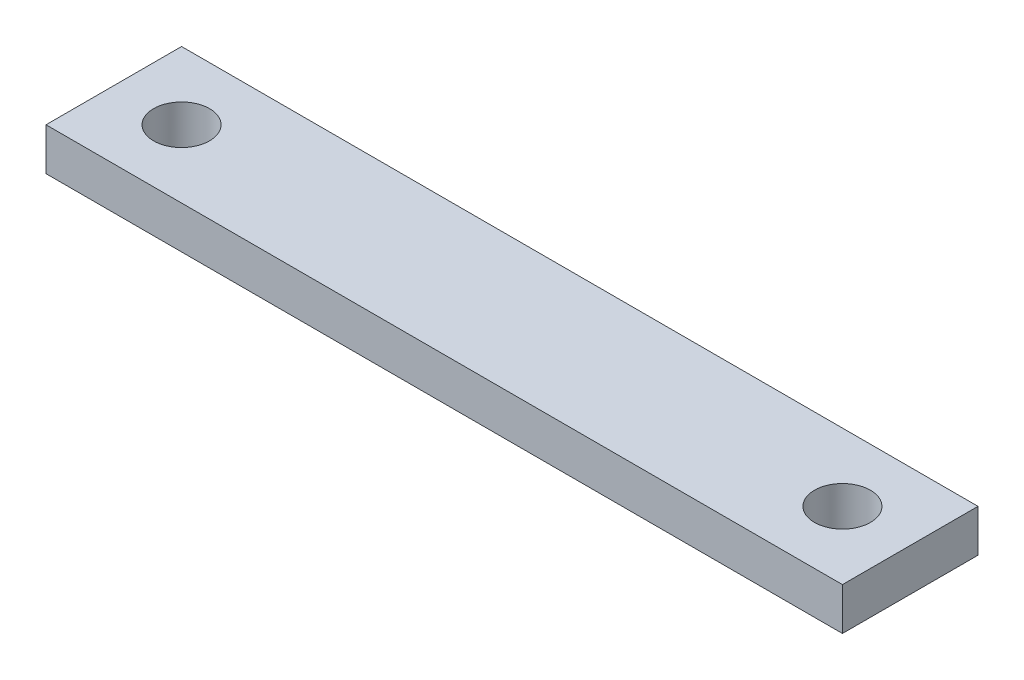
ISO-10303-21;
HEADER;
FILE_DESCRIPTION(('STEP AP214'),'2;1');
FILE_NAME('part.step','',(''),(''),'','','');
FILE_SCHEMA(('AUTOMOTIVE_DESIGN { 1 0 10303 214 1 1 1 1 }'));
ENDSEC;
DATA;
#1=APPLICATION_CONTEXT('core data for automotive mechanical design processes');
#2=APPLICATION_PROTOCOL_DEFINITION('international standard','automotive_design',2000,#1);
#3=PRODUCT_CONTEXT('',#1,'mechanical');
#4=PRODUCT('Part','Part','',(#3));
#5=PRODUCT_RELATED_PRODUCT_CATEGORY('part','',(#4));
#6=PRODUCT_DEFINITION_FORMATION('','',#4);
#7=PRODUCT_DEFINITION_CONTEXT('part definition',#1,'design');
#8=PRODUCT_DEFINITION('design','',#6,#7);
#9=PRODUCT_DEFINITION_SHAPE('','',#8);
#10=(LENGTH_UNIT() NAMED_UNIT(*) SI_UNIT(.MILLI.,.METRE.));
#11=(NAMED_UNIT(*) PLANE_ANGLE_UNIT() SI_UNIT($,.RADIAN.));
#12=(NAMED_UNIT(*) SI_UNIT($,.STERADIAN.) SOLID_ANGLE_UNIT());
#13=UNCERTAINTY_MEASURE_WITH_UNIT(LENGTH_MEASURE(1.E-05),#10,'distance_accuracy_value','');
#14=(GEOMETRIC_REPRESENTATION_CONTEXT(3) GLOBAL_UNCERTAINTY_ASSIGNED_CONTEXT((#13)) GLOBAL_UNIT_ASSIGNED_CONTEXT((#10,
#11,#12)) REPRESENTATION_CONTEXT('',''));
#15=CARTESIAN_POINT('',(0.,0.,0.));
#16=DIRECTION('',(0.,0.,1.));
#17=DIRECTION('',(1.,0.,0.));
#18=AXIS2_PLACEMENT_3D('',#15,#16,#17);
#19=CARTESIAN_POINT('',(0.,2.5,0.));
#20=DIRECTION('',(1.,0.,0.));
#21=DIRECTION('',(0.,0.,-1.));
#22=AXIS2_PLACEMENT_3D('',#19,#20,#21);
#23=PLANE('',#22);
#24=DIRECTION('',(0.,0.,1.));
#25=VECTOR('',#24,1.);
#26=CARTESIAN_POINT('',(0.,0.,0.));
#27=LINE('',#26,#25);
#28=CARTESIAN_POINT('',(0.,0.,-8.));
#29=VERTEX_POINT('',#28);
#30=CARTESIAN_POINT('',(0.,0.,0.));
#31=VERTEX_POINT('',#30);
#32=EDGE_CURVE('E98',#29,#31,#27,.T.);
#33=ORIENTED_EDGE('',*,*,#32,.T.);
#34=DIRECTION('',(0.,-1.,0.));
#35=VECTOR('',#34,1.);
#36=CARTESIAN_POINT('',(0.,2.5,0.));
#37=LINE('',#36,#35);
#38=CARTESIAN_POINT('',(0.,2.5,0.));
#39=VERTEX_POINT('',#38);
#40=EDGE_CURVE('E11',#39,#31,#37,.T.);
#41=ORIENTED_EDGE('',*,*,#40,.F.);
#42=DIRECTION('',(0.,0.,1.));
#43=VECTOR('',#42,1.);
#44=CARTESIAN_POINT('',(0.,2.5,0.));
#45=LINE('',#44,#43);
#46=CARTESIAN_POINT('',(0.,2.5,-8.));
#47=VERTEX_POINT('',#46);
#48=EDGE_CURVE('E86',#47,#39,#45,.T.);
#49=ORIENTED_EDGE('',*,*,#48,.F.);
#50=DIRECTION('',(0.,-1.,0.));
#51=VECTOR('',#50,1.);
#52=CARTESIAN_POINT('',(0.,2.5,-8.));
#53=LINE('',#52,#51);
#54=EDGE_CURVE('E94',#47,#29,#53,.T.);
#55=ORIENTED_EDGE('',*,*,#54,.T.);
#56=EDGE_LOOP('',(#33,#41,#49,#55));
#57=FACE_BOUND('',#56,.T.);
#58=ADVANCED_FACE('F35',(#57),#23,.F.);
#59=CARTESIAN_POINT('',(0.,2.5,0.));
#60=DIRECTION('',(0.,0.,-1.));
#61=DIRECTION('',(-1.,0.,0.));
#62=AXIS2_PLACEMENT_3D('',#59,#60,#61);
#63=PLANE('',#62);
#64=DIRECTION('',(1.,0.,0.));
#65=VECTOR('',#64,1.);
#66=CARTESIAN_POINT('',(0.,0.,0.));
#67=LINE('',#66,#65);
#68=CARTESIAN_POINT('',(47.,0.,0.));
#69=VERTEX_POINT('',#68);
#70=EDGE_CURVE('E90',#31,#69,#67,.T.);
#71=ORIENTED_EDGE('',*,*,#70,.T.);
#72=DIRECTION('',(0.,-1.,0.));
#73=VECTOR('',#72,1.);
#74=CARTESIAN_POINT('',(47.,2.5,0.));
#75=LINE('',#74,#73);
#76=CARTESIAN_POINT('',(47.,2.5,0.));
#77=VERTEX_POINT('',#76);
#78=EDGE_CURVE('E43',#77,#69,#75,.T.);
#79=ORIENTED_EDGE('',*,*,#78,.F.);
#80=DIRECTION('',(1.,0.,0.));
#81=VECTOR('',#80,1.);
#82=CARTESIAN_POINT('',(0.,2.5,0.));
#83=LINE('',#82,#81);
#84=EDGE_CURVE('E81',#39,#77,#83,.T.);
#85=ORIENTED_EDGE('',*,*,#84,.F.);
#86=ORIENTED_EDGE('',*,*,#40,.T.);
#87=EDGE_LOOP('',(#71,#79,#85,#86));
#88=FACE_BOUND('',#87,.T.);
#89=ADVANCED_FACE('F89',(#88),#63,.F.);
#90=CARTESIAN_POINT('',(47.,2.5,0.));
#91=DIRECTION('',(-1.,0.,0.));
#92=DIRECTION('',(0.,0.,1.));
#93=AXIS2_PLACEMENT_3D('',#90,#91,#92);
#94=PLANE('',#93);
#95=DIRECTION('',(0.,0.,-1.));
#96=VECTOR('',#95,1.);
#97=CARTESIAN_POINT('',(47.,0.,0.));
#98=LINE('',#97,#96);
#99=CARTESIAN_POINT('',(47.,0.,-8.));
#100=VERTEX_POINT('',#99);
#101=EDGE_CURVE('E68',#69,#100,#98,.T.);
#102=ORIENTED_EDGE('',*,*,#101,.T.);
#103=DIRECTION('',(0.,-1.,0.));
#104=VECTOR('',#103,1.);
#105=CARTESIAN_POINT('',(47.,2.5,-8.));
#106=LINE('',#105,#104);
#107=CARTESIAN_POINT('',(47.,2.5,-8.));
#108=VERTEX_POINT('',#107);
#109=EDGE_CURVE('E91',#108,#100,#106,.T.);
#110=ORIENTED_EDGE('',*,*,#109,.F.);
#111=DIRECTION('',(0.,0.,-1.));
#112=VECTOR('',#111,1.);
#113=CARTESIAN_POINT('',(47.,2.5,0.));
#114=LINE('',#113,#112);
#115=EDGE_CURVE('E84',#77,#108,#114,.T.);
#116=ORIENTED_EDGE('',*,*,#115,.F.);
#117=ORIENTED_EDGE('',*,*,#78,.T.);
#118=EDGE_LOOP('',(#102,#110,#116,#117));
#119=FACE_BOUND('',#118,.T.);
#120=ADVANCED_FACE('F92',(#119),#94,.F.);
#121=CARTESIAN_POINT('',(0.,2.5,-8.));
#122=DIRECTION('',(0.,0.,1.));
#123=DIRECTION('',(1.,0.,0.));
#124=AXIS2_PLACEMENT_3D('',#121,#122,#123);
#125=PLANE('',#124);
#126=DIRECTION('',(-1.,0.,0.));
#127=VECTOR('',#126,1.);
#128=CARTESIAN_POINT('',(0.,0.,-8.));
#129=LINE('',#128,#127);
#130=EDGE_CURVE('E74',#100,#29,#129,.T.);
#131=ORIENTED_EDGE('',*,*,#130,.T.);
#132=ORIENTED_EDGE('',*,*,#54,.F.);
#133=DIRECTION('',(-1.,0.,0.));
#134=VECTOR('',#133,1.);
#135=CARTESIAN_POINT('',(0.,2.5,-8.));
#136=LINE('',#135,#134);
#137=EDGE_CURVE('E51',#108,#47,#136,.T.);
#138=ORIENTED_EDGE('',*,*,#137,.F.);
#139=ORIENTED_EDGE('',*,*,#109,.T.);
#140=EDGE_LOOP('',(#131,#132,#138,#139));
#141=FACE_BOUND('',#140,.T.);
#142=ADVANCED_FACE('F106',(#141),#125,.F.);
#143=CARTESIAN_POINT('',(0.,2.5,0.));
#144=DIRECTION('',(0.,-1.,0.));
#145=DIRECTION('',(0.,0.,-1.));
#146=AXIS2_PLACEMENT_3D('',#143,#144,#145);
#147=PLANE('',#146);
#148=CARTESIAN_POINT('',(4.,2.5,-4.));
#149=DIRECTION('',(0.,-1.,0.));
#150=DIRECTION('',(0.,0.,-1.));
#151=AXIS2_PLACEMENT_3D('',#148,#149,#150);
#152=CIRCLE('',#151,1.65);
#153=CARTESIAN_POINT('',(4.,2.5,-5.65));
#154=VERTEX_POINT('',#153);
#155=EDGE_CURVE('E101',#154,#154,#152,.T.);
#156=ORIENTED_EDGE('',*,*,#155,.T.);
#157=EDGE_LOOP('',(#156));
#158=FACE_BOUND('',#157,.T.);
#159=CARTESIAN_POINT('',(43.,2.5,-4.));
#160=DIRECTION('',(0.,-1.,0.));
#161=DIRECTION('',(0.,0.,-1.));
#162=AXIS2_PLACEMENT_3D('',#159,#160,#161);
#163=CIRCLE('',#162,1.65);
#164=CARTESIAN_POINT('',(43.,2.5,-5.65));
#165=VERTEX_POINT('',#164);
#166=EDGE_CURVE('E112',#165,#165,#163,.T.);
#167=ORIENTED_EDGE('',*,*,#166,.T.);
#168=EDGE_LOOP('',(#167));
#169=FACE_BOUND('',#168,.T.);
#170=ORIENTED_EDGE('',*,*,#48,.T.);
#171=ORIENTED_EDGE('',*,*,#84,.T.);
#172=ORIENTED_EDGE('',*,*,#115,.T.);
#173=ORIENTED_EDGE('',*,*,#137,.T.);
#174=EDGE_LOOP('',(#170,#171,#172,#173));
#175=FACE_BOUND('',#174,.T.);
#176=ADVANCED_FACE('F82',(#158,#169,#175),#147,.F.);
#177=CARTESIAN_POINT('',(0.,0.,0.));
#178=DIRECTION('',(0.,-1.,0.));
#179=DIRECTION('',(0.,0.,-1.));
#180=AXIS2_PLACEMENT_3D('',#177,#178,#179);
#181=PLANE('',#180);
#182=CARTESIAN_POINT('',(4.,0.,-4.));
#183=DIRECTION('',(0.,1.,0.));
#184=DIRECTION('',(0.,0.,1.));
#185=AXIS2_PLACEMENT_3D('',#182,#183,#184);
#186=CIRCLE('',#185,1.65);
#187=CARTESIAN_POINT('',(4.,0.,-2.35));
#188=VERTEX_POINT('',#187);
#189=EDGE_CURVE('E115',#188,#188,#186,.T.);
#190=ORIENTED_EDGE('',*,*,#189,.T.);
#191=EDGE_LOOP('',(#190));
#192=FACE_BOUND('',#191,.T.);
#193=CARTESIAN_POINT('',(43.,0.,-4.));
#194=DIRECTION('',(0.,1.,0.));
#195=DIRECTION('',(0.,0.,1.));
#196=AXIS2_PLACEMENT_3D('',#193,#194,#195);
#197=CIRCLE('',#196,1.65);
#198=CARTESIAN_POINT('',(43.,0.,-2.35));
#199=VERTEX_POINT('',#198);
#200=EDGE_CURVE('E116',#199,#199,#197,.T.);
#201=ORIENTED_EDGE('',*,*,#200,.T.);
#202=EDGE_LOOP('',(#201));
#203=FACE_BOUND('',#202,.T.);
#204=ORIENTED_EDGE('',*,*,#32,.F.);
#205=ORIENTED_EDGE('',*,*,#130,.F.);
#206=ORIENTED_EDGE('',*,*,#101,.F.);
#207=ORIENTED_EDGE('',*,*,#70,.F.);
#208=EDGE_LOOP('',(#204,#205,#206,#207));
#209=FACE_BOUND('',#208,.T.);
#210=ADVANCED_FACE('F109',(#192,#203,#209),#181,.T.);
#211=CARTESIAN_POINT('',(43.,7.16690475583122,-4.));
#212=DIRECTION('',(0.,-1.,0.));
#213=DIRECTION('',(0.,0.,-1.));
#214=AXIS2_PLACEMENT_3D('',#211,#212,#213);
#215=CYLINDRICAL_SURFACE('',#214,1.65);
#216=ORIENTED_EDGE('',*,*,#166,.F.);
#217=EDGE_LOOP('',(#216));
#218=FACE_BOUND('',#217,.T.);
#219=ORIENTED_EDGE('',*,*,#200,.F.);
#220=EDGE_LOOP('',(#219));
#221=FACE_BOUND('',#220,.T.);
#222=ADVANCED_FACE('F128',(#218,#221),#215,.F.);
#223=CARTESIAN_POINT('',(4.,7.16690475583122,-4.));
#224=DIRECTION('',(0.,-1.,0.));
#225=DIRECTION('',(0.,0.,-1.));
#226=AXIS2_PLACEMENT_3D('',#223,#224,#225);
#227=CYLINDRICAL_SURFACE('',#226,1.65);
#228=ORIENTED_EDGE('',*,*,#155,.F.);
#229=EDGE_LOOP('',(#228));
#230=FACE_BOUND('',#229,.T.);
#231=ORIENTED_EDGE('',*,*,#189,.F.);
#232=EDGE_LOOP('',(#231));
#233=FACE_BOUND('',#232,.T.);
#234=ADVANCED_FACE('F126',(#230,#233),#227,.F.);
#235=CLOSED_SHELL('',(#58,#89,#120,#142,#176,#210,#222,#234));
#236=MANIFOLD_SOLID_BREP('B2',#235);
#237=ADVANCED_BREP_SHAPE_REPRESENTATION('',(#18,#236),#14);
#238=SHAPE_DEFINITION_REPRESENTATION(#9,#237);
ENDSEC;
END-ISO-10303-21;
